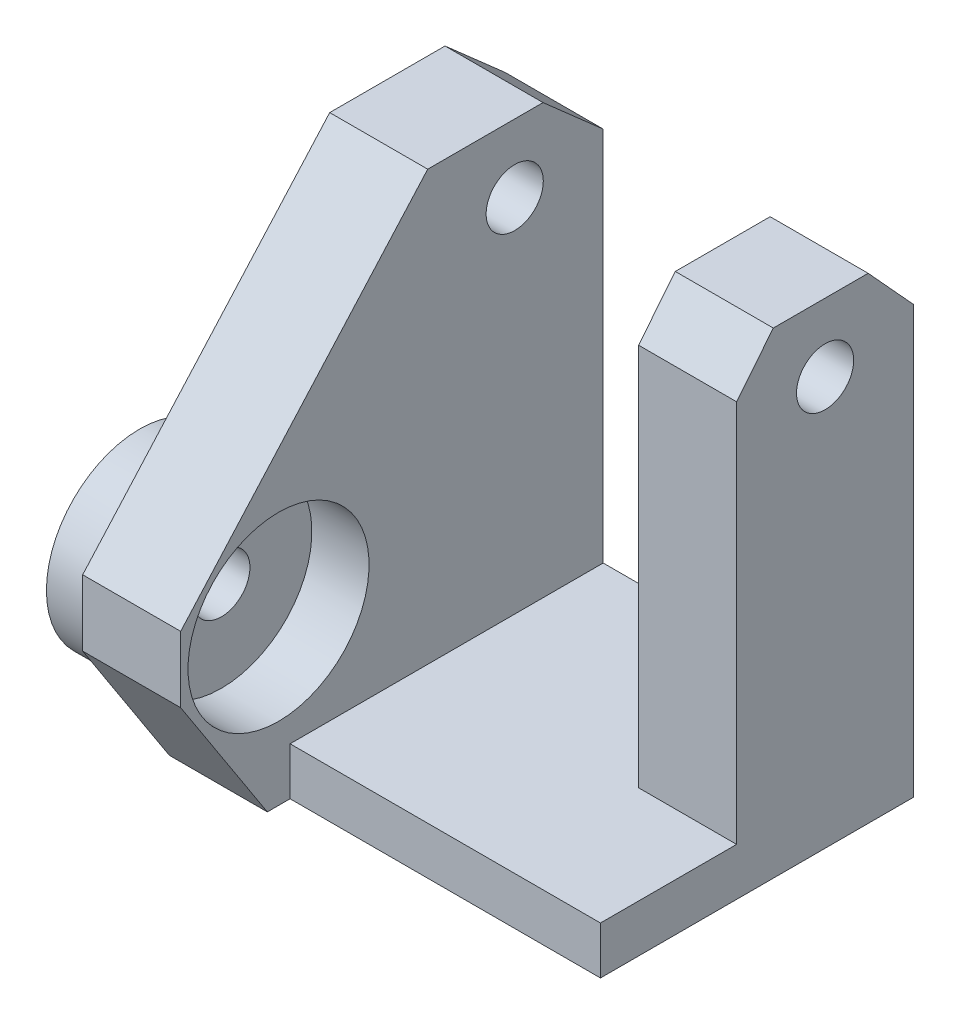
ISO-10303-21;
HEADER;
FILE_DESCRIPTION(('STEP AP214'),'2;1');
FILE_NAME('part.step','',(''),(''),'','','');
FILE_SCHEMA(('AUTOMOTIVE_DESIGN { 1 0 10303 214 1 1 1 1 }'));
ENDSEC;
DATA;
#1=APPLICATION_CONTEXT('core data for automotive mechanical design processes');
#2=APPLICATION_PROTOCOL_DEFINITION('international standard','automotive_design',2000,#1);
#3=PRODUCT_CONTEXT('',#1,'mechanical');
#4=PRODUCT('Part','Part','',(#3));
#5=PRODUCT_RELATED_PRODUCT_CATEGORY('part','',(#4));
#6=PRODUCT_DEFINITION_FORMATION('','',#4);
#7=PRODUCT_DEFINITION_CONTEXT('part definition',#1,'design');
#8=PRODUCT_DEFINITION('design','',#6,#7);
#9=PRODUCT_DEFINITION_SHAPE('','',#8);
#10=(LENGTH_UNIT() NAMED_UNIT(*) SI_UNIT(.MILLI.,.METRE.));
#11=(NAMED_UNIT(*) PLANE_ANGLE_UNIT() SI_UNIT($,.RADIAN.));
#12=(NAMED_UNIT(*) SI_UNIT($,.STERADIAN.) SOLID_ANGLE_UNIT());
#13=UNCERTAINTY_MEASURE_WITH_UNIT(LENGTH_MEASURE(1.E-05),#10,'distance_accuracy_value','');
#14=(GEOMETRIC_REPRESENTATION_CONTEXT(3) GLOBAL_UNCERTAINTY_ASSIGNED_CONTEXT((#13)) GLOBAL_UNIT_ASSIGNED_CONTEXT((#10,
#11,#12)) REPRESENTATION_CONTEXT('',''));
#15=CARTESIAN_POINT('',(0.,0.,0.));
#16=DIRECTION('',(0.,0.,1.));
#17=DIRECTION('',(1.,0.,0.));
#18=AXIS2_PLACEMENT_3D('',#15,#16,#17);
#19=CARTESIAN_POINT('',(-15.,0.,13.));
#20=DIRECTION('',(1.,0.,0.));
#21=DIRECTION('',(0.,0.,-1.));
#22=AXIS2_PLACEMENT_3D('',#19,#20,#21);
#23=PLANE('',#22);
#24=CARTESIAN_POINT('',(-15.,12.,23.8493515728975));
#25=DIRECTION('',(-1.,0.,0.));
#26=DIRECTION('',(0.,-1.,0.));
#27=AXIS2_PLACEMENT_3D('',#24,#25,#26);
#28=CIRCLE('',#27,2.1);
#29=CARTESIAN_POINT('',(-15.,9.9,23.8493515728975));
#30=VERTEX_POINT('',#29);
#31=EDGE_CURVE('E259',#30,#30,#28,.T.);
#32=ORIENTED_EDGE('',*,*,#31,.F.);
#33=EDGE_LOOP('',(#32));
#34=FACE_BOUND('',#33,.T.);
#35=CARTESIAN_POINT('',(-15.,12.,23.8493515728975));
#36=DIRECTION('',(-1.,0.,0.));
#37=DIRECTION('',(0.,0.,1.));
#38=AXIS2_PLACEMENT_3D('',#35,#36,#37);
#39=CIRCLE('',#38,5.65);
#40=CARTESIAN_POINT('',(-15.,12.,29.4993515728975));
#41=VERTEX_POINT('',#40);
#42=EDGE_CURVE('E321',#41,#41,#39,.T.);
#43=ORIENTED_EDGE('',*,*,#42,.T.);
#44=EDGE_LOOP('',(#43));
#45=FACE_BOUND('',#44,.T.);
#46=ADVANCED_FACE('F37',(#34,#45),#23,.F.);
#47=CARTESIAN_POINT('',(5.,12.,23.8493515728975));
#48=DIRECTION('',(-1.,0.,0.));
#49=DIRECTION('',(0.,-1.,0.));
#50=AXIS2_PLACEMENT_3D('',#47,#48,#49);
#51=CYLINDRICAL_SURFACE('',#50,2.1);
#52=ORIENTED_EDGE('',*,*,#31,.T.);
#53=EDGE_LOOP('',(#52));
#54=FACE_BOUND('',#53,.T.);
#55=CARTESIAN_POINT('',(-12.,12.,23.8493515728975));
#56=DIRECTION('',(1.,0.,0.));
#57=DIRECTION('',(0.,1.,0.));
#58=AXIS2_PLACEMENT_3D('',#55,#56,#57);
#59=CIRCLE('',#58,2.1);
#60=CARTESIAN_POINT('',(-12.,14.1,23.8493515728975));
#61=VERTEX_POINT('',#60);
#62=EDGE_CURVE('E179',#61,#61,#59,.F.);
#63=ORIENTED_EDGE('',*,*,#62,.F.);
#64=EDGE_LOOP('',(#63));
#65=FACE_BOUND('',#64,.T.);
#66=ADVANCED_FACE('F341',(#54,#65),#51,.F.);
#67=CARTESIAN_POINT('',(0.,0.,13.));
#68=DIRECTION('',(0.,0.,-1.));
#69=DIRECTION('',(-1.,0.,0.));
#70=AXIS2_PLACEMENT_3D('',#67,#68,#69);
#71=PLANE('',#70);
#72=DIRECTION('',(0.,1.,0.));
#73=VECTOR('',#72,1.);
#74=CARTESIAN_POINT('',(15.,0.,13.));
#75=LINE('',#74,#73);
#76=CARTESIAN_POINT('',(15.,3.5,13.));
#77=VERTEX_POINT('',#76);
#78=CARTESIAN_POINT('',(15.,31.6570509554715,13.));
#79=VERTEX_POINT('',#78);
#80=EDGE_CURVE('E199',#77,#79,#75,.T.);
#81=ORIENTED_EDGE('',*,*,#80,.T.);
#82=DIRECTION('',(1.,0.,0.));
#83=VECTOR('',#82,1.);
#84=CARTESIAN_POINT('',(4.99999999999999,31.6570509554715,13.));
#85=LINE('',#84,#83);
#86=CARTESIAN_POINT('',(7.8,31.6570509554715,13.));
#87=VERTEX_POINT('',#86);
#88=EDGE_CURVE('E160',#87,#79,#85,.T.);
#89=ORIENTED_EDGE('',*,*,#88,.F.);
#90=DIRECTION('',(0.,-1.,0.));
#91=VECTOR('',#90,1.);
#92=CARTESIAN_POINT('',(7.8,35.,13.));
#93=LINE('',#92,#91);
#94=CARTESIAN_POINT('',(7.8,3.5,13.));
#95=VERTEX_POINT('',#94);
#96=EDGE_CURVE('E190',#87,#95,#93,.T.);
#97=ORIENTED_EDGE('',*,*,#96,.T.);
#98=DIRECTION('',(-1.,0.,0.));
#99=VECTOR('',#98,1.);
#100=CARTESIAN_POINT('',(-7.8,3.5,13.));
#101=LINE('',#100,#99);
#102=EDGE_CURVE('E182',#77,#95,#101,.T.);
#103=ORIENTED_EDGE('',*,*,#102,.F.);
#104=EDGE_LOOP('',(#81,#89,#97,#103));
#105=FACE_BOUND('',#104,.T.);
#106=ADVANCED_FACE('F195',(#105),#71,.F.);
#107=CARTESIAN_POINT('',(-7.8,35.,13.));
#108=DIRECTION('',(-1.,0.,0.));
#109=DIRECTION('',(0.,-1.,0.));
#110=AXIS2_PLACEMENT_3D('',#107,#108,#109);
#111=PLANE('',#110);
#112=CARTESIAN_POINT('',(-7.8,12.,23.8493515728975));
#113=DIRECTION('',(1.,0.,0.));
#114=DIRECTION('',(0.,1.,0.));
#115=AXIS2_PLACEMENT_3D('',#112,#113,#114);
#116=CIRCLE('',#115,6.65);
#117=CARTESIAN_POINT('',(-7.8,18.65,23.8493515728975));
#118=VERTEX_POINT('',#117);
#119=EDGE_CURVE('E240',#118,#118,#116,.T.);
#120=ORIENTED_EDGE('',*,*,#119,.F.);
#121=EDGE_LOOP('',(#120));
#122=FACE_BOUND('',#121,.T.);
#123=CARTESIAN_POINT('',(-7.8,30.,6.5));
#124=DIRECTION('',(-1.,0.,0.));
#125=DIRECTION('',(0.,-1.,0.));
#126=AXIS2_PLACEMENT_3D('',#123,#124,#125);
#127=CIRCLE('',#126,2.1);
#128=CARTESIAN_POINT('',(-7.8,27.9,6.5));
#129=VERTEX_POINT('',#128);
#130=EDGE_CURVE('E174',#129,#129,#127,.T.);
#131=ORIENTED_EDGE('',*,*,#130,.T.);
#132=EDGE_LOOP('',(#131));
#133=FACE_BOUND('',#132,.T.);
#134=DIRECTION('',(0.,-1.,0.));
#135=VECTOR('',#134,1.);
#136=CARTESIAN_POINT('',(-7.8,35.,31.0362025201516));
#137=LINE('',#136,#135);
#138=CARTESIAN_POINT('',(-7.8,14.6716908801956,31.0362025201516));
#139=VERTEX_POINT('',#138);
#140=CARTESIAN_POINT('',(-7.8,9.81434295701585,31.0362025201516));
#141=VERTEX_POINT('',#140);
#142=EDGE_CURVE('E237',#139,#141,#137,.T.);
#143=ORIENTED_EDGE('',*,*,#142,.T.);
#144=DIRECTION('',(0.,-0.838960810902547,-0.544191839124532));
#145=VECTOR('',#144,1.);
#146=CARTESIAN_POINT('',(-7.8,19.3068699519676,37.1935291272964));
#147=LINE('',#146,#145);
#148=CARTESIAN_POINT('',(-7.79999999999999,0.,24.6701300240696));
#149=VERTEX_POINT('',#148);
#150=EDGE_CURVE('E234',#141,#149,#147,.T.);
#151=ORIENTED_EDGE('',*,*,#150,.T.);
#152=DIRECTION('',(0.,0.,-1.));
#153=VECTOR('',#152,1.);
#154=CARTESIAN_POINT('',(-7.79999999999999,0.,33.));
#155=LINE('',#154,#153);
#156=CARTESIAN_POINT('',(-7.8,0.,23.));
#157=VERTEX_POINT('',#156);
#158=EDGE_CURVE('E262',#149,#157,#155,.T.);
#159=ORIENTED_EDGE('',*,*,#158,.T.);
#160=DIRECTION('',(0.,-1.,0.));
#161=VECTOR('',#160,1.);
#162=CARTESIAN_POINT('',(-7.8,3.5,23.));
#163=LINE('',#162,#161);
#164=CARTESIAN_POINT('',(-7.8,3.5,23.));
#165=VERTEX_POINT('',#164);
#166=EDGE_CURVE('E245',#165,#157,#163,.T.);
#167=ORIENTED_EDGE('',*,*,#166,.F.);
#168=DIRECTION('',(0.,0.,-1.));
#169=VECTOR('',#168,1.);
#170=CARTESIAN_POINT('',(-7.8,3.5,13.));
#171=LINE('',#170,#169);
#172=CARTESIAN_POINT('',(-7.8,3.5,0.));
#173=VERTEX_POINT('',#172);
#174=EDGE_CURVE('E292',#165,#173,#171,.T.);
#175=ORIENTED_EDGE('',*,*,#174,.T.);
#176=DIRECTION('',(0.,1.,0.));
#177=VECTOR('',#176,1.);
#178=CARTESIAN_POINT('',(-7.8,35.,0.));
#179=LINE('',#178,#177);
#180=CARTESIAN_POINT('',(-7.8,31.1079291114581,0.));
#181=VERTEX_POINT('',#180);
#182=EDGE_CURVE('E273',#173,#181,#179,.T.);
#183=ORIENTED_EDGE('',*,*,#182,.T.);
#184=DIRECTION('',(0.,0.660921876712559,0.750454710747257));
#185=VECTOR('',#184,1.);
#186=CARTESIAN_POINT('',(-7.8,39.2559498363633,9.2518053218123));
#187=LINE('',#186,#185);
#188=CARTESIAN_POINT('',(-7.8,35.,4.41931646656453));
#189=VERTEX_POINT('',#188);
#190=EDGE_CURVE('E220',#181,#189,#187,.T.);
#191=ORIENTED_EDGE('',*,*,#190,.T.);
#192=DIRECTION('',(0.,0.,-1.));
#193=VECTOR('',#192,1.);
#194=CARTESIAN_POINT('',(-7.8,35.,13.));
#195=LINE('',#194,#193);
#196=CARTESIAN_POINT('',(-7.8,35.,12.8907711424314));
#197=VERTEX_POINT('',#196);
#198=EDGE_CURVE('E289',#197,#189,#195,.T.);
#199=ORIENTED_EDGE('',*,*,#198,.F.);
#200=DIRECTION('',(0.,-0.746025983320998,0.665916835806047));
#201=VECTOR('',#200,1.);
#202=CARTESIAN_POINT('',(-7.8,34.9457360579752,12.93920815854));
#203=LINE('',#202,#201);
#204=EDGE_CURVE('E231',#197,#139,#203,.T.);
#205=ORIENTED_EDGE('',*,*,#204,.T.);
#206=EDGE_LOOP('',(#143,#151,#159,#167,#175,#183,#191,#199,#205));
#207=FACE_BOUND('',#206,.T.);
#208=ADVANCED_FACE('F305',(#122,#133,#207),#111,.F.);
#209=CARTESIAN_POINT('',(-15.,12.,23.8493515728975));
#210=DIRECTION('',(1.,0.,0.));
#211=DIRECTION('',(0.,0.,-1.));
#212=AXIS2_PLACEMENT_3D('',#209,#210,#211);
#213=CIRCLE('',#212,6.85);
#214=CARTESIAN_POINT('',(-15.,12.,16.9993515728975));
#215=VERTEX_POINT('',#214);
#216=EDGE_CURVE('E11',#215,#215,#213,.F.);
#217=ORIENTED_EDGE('',*,*,#216,.F.);
#218=EDGE_LOOP('',(#217));
#219=FACE_BOUND('',#218,.T.);
#220=CARTESIAN_POINT('',(-15.,30.,6.5));
#221=DIRECTION('',(1.,0.,0.));
#222=DIRECTION('',(0.,1.,0.));
#223=AXIS2_PLACEMENT_3D('',#220,#221,#222);
#224=CIRCLE('',#223,2.1);
#225=CARTESIAN_POINT('',(-15.,32.1,6.5));
#226=VERTEX_POINT('',#225);
#227=EDGE_CURVE('E178',#226,#226,#224,.T.);
#228=ORIENTED_EDGE('',*,*,#227,.T.);
#229=EDGE_LOOP('',(#228));
#230=FACE_BOUND('',#229,.T.);
#231=DIRECTION('',(0.,0.,-1.));
#232=VECTOR('',#231,1.);
#233=CARTESIAN_POINT('',(-15.,0.,13.));
#234=LINE('',#233,#232);
#235=CARTESIAN_POINT('',(-15.,0.,24.6701300240696));
#236=VERTEX_POINT('',#235);
#237=CARTESIAN_POINT('',(-15.,0.,0.));
#238=VERTEX_POINT('',#237);
#239=EDGE_CURVE('E166',#236,#238,#234,.T.);
#240=ORIENTED_EDGE('',*,*,#239,.F.);
#241=DIRECTION('',(0.,-0.838960810902548,-0.544191839124532));
#242=VECTOR('',#241,1.);
#243=CARTESIAN_POINT('',(-15.,9.81434295701585,31.0362025201516));
#244=LINE('',#243,#242);
#245=CARTESIAN_POINT('',(-15.,9.81434295701585,31.0362025201516));
#246=VERTEX_POINT('',#245);
#247=EDGE_CURVE('E214',#246,#236,#244,.T.);
#248=ORIENTED_EDGE('',*,*,#247,.F.);
#249=DIRECTION('',(0.,-1.,0.));
#250=VECTOR('',#249,1.);
#251=CARTESIAN_POINT('',(-15.,14.6716908801956,31.0362025201516));
#252=LINE('',#251,#250);
#253=CARTESIAN_POINT('',(-15.,14.6716908801956,31.0362025201516));
#254=VERTEX_POINT('',#253);
#255=EDGE_CURVE('E210',#254,#246,#252,.T.);
#256=ORIENTED_EDGE('',*,*,#255,.F.);
#257=DIRECTION('',(0.,-0.746025983320998,0.665916835806047));
#258=VECTOR('',#257,1.);
#259=CARTESIAN_POINT('',(-15.,35.,12.8907711424314));
#260=LINE('',#259,#258);
#261=CARTESIAN_POINT('',(-15.,35.,12.8907711424314));
#262=VERTEX_POINT('',#261);
#263=EDGE_CURVE('E207',#262,#254,#260,.T.);
#264=ORIENTED_EDGE('',*,*,#263,.F.);
#265=DIRECTION('',(0.,0.,-1.));
#266=VECTOR('',#265,1.);
#267=CARTESIAN_POINT('',(-15.,35.,13.));
#268=LINE('',#267,#266);
#269=CARTESIAN_POINT('',(-15.,35.,4.41931646656453));
#270=VERTEX_POINT('',#269);
#271=EDGE_CURVE('E275',#262,#270,#268,.T.);
#272=ORIENTED_EDGE('',*,*,#271,.T.);
#273=DIRECTION('',(0.,0.660921876712559,0.750454710747257));
#274=VECTOR('',#273,1.);
#275=CARTESIAN_POINT('',(-15.,31.1079291114581,0.));
#276=LINE('',#275,#274);
#277=CARTESIAN_POINT('',(-15.,31.1079291114581,0.));
#278=VERTEX_POINT('',#277);
#279=EDGE_CURVE('E206',#278,#270,#276,.T.);
#280=ORIENTED_EDGE('',*,*,#279,.F.);
#281=DIRECTION('',(0.,-1.,0.));
#282=VECTOR('',#281,1.);
#283=CARTESIAN_POINT('',(-15.,0.,0.));
#284=LINE('',#283,#282);
#285=EDGE_CURVE('E271',#278,#238,#284,.T.);
#286=ORIENTED_EDGE('',*,*,#285,.T.);
#287=EDGE_LOOP('',(#240,#248,#256,#264,#272,#280,#286));
#288=FACE_BOUND('',#287,.T.);
#289=ADVANCED_FACE('F39',(#219,#230,#288),#23,.F.);
#290=CARTESIAN_POINT('',(15.,0.,13.));
#291=DIRECTION('',(0.,1.,0.));
#292=DIRECTION('',(-1.,0.,0.));
#293=AXIS2_PLACEMENT_3D('',#290,#291,#292);
#294=PLANE('',#293);
#295=ORIENTED_EDGE('',*,*,#158,.F.);
#296=DIRECTION('',(-1.,0.,0.));
#297=VECTOR('',#296,1.);
#298=CARTESIAN_POINT('',(-5.,0.,24.6701300240696));
#299=LINE('',#298,#297);
#300=EDGE_CURVE('E217',#149,#236,#299,.T.);
#301=ORIENTED_EDGE('',*,*,#300,.T.);
#302=ORIENTED_EDGE('',*,*,#239,.T.);
#303=DIRECTION('',(1.,0.,0.));
#304=VECTOR('',#303,1.);
#305=CARTESIAN_POINT('',(15.,0.,0.));
#306=LINE('',#305,#304);
#307=CARTESIAN_POINT('',(15.,0.,0.));
#308=VERTEX_POINT('',#307);
#309=EDGE_CURVE('E278',#238,#308,#306,.T.);
#310=ORIENTED_EDGE('',*,*,#309,.T.);
#311=DIRECTION('',(0.,0.,-1.));
#312=VECTOR('',#311,1.);
#313=CARTESIAN_POINT('',(15.,0.,13.));
#314=LINE('',#313,#312);
#315=CARTESIAN_POINT('',(15.,0.,23.));
#316=VERTEX_POINT('',#315);
#317=EDGE_CURVE('E163',#316,#308,#314,.T.);
#318=ORIENTED_EDGE('',*,*,#317,.F.);
#319=DIRECTION('',(1.,0.,0.));
#320=VECTOR('',#319,1.);
#321=CARTESIAN_POINT('',(-7.8,0.,23.));
#322=LINE('',#321,#320);
#323=EDGE_CURVE('E248',#157,#316,#322,.T.);
#324=ORIENTED_EDGE('',*,*,#323,.F.);
#325=EDGE_LOOP('',(#295,#301,#302,#310,#318,#324));
#326=FACE_BOUND('',#325,.T.);
#327=ADVANCED_FACE('F350',(#326),#294,.F.);
#328=CARTESIAN_POINT('',(15.,0.,13.));
#329=DIRECTION('',(-1.,0.,0.));
#330=DIRECTION('',(0.,-1.,0.));
#331=AXIS2_PLACEMENT_3D('',#328,#329,#330);
#332=PLANE('',#331);
#333=CARTESIAN_POINT('',(15.,30.,6.5));
#334=DIRECTION('',(1.,0.,0.));
#335=DIRECTION('',(0.,1.,0.));
#336=AXIS2_PLACEMENT_3D('',#333,#334,#335);
#337=CIRCLE('',#336,2.1);
#338=CARTESIAN_POINT('',(15.,32.1,6.5));
#339=VERTEX_POINT('',#338);
#340=EDGE_CURVE('E264',#339,#339,#337,.T.);
#341=ORIENTED_EDGE('',*,*,#340,.F.);
#342=EDGE_LOOP('',(#341));
#343=FACE_BOUND('',#342,.T.);
#344=DIRECTION('',(0.,1.,0.));
#345=VECTOR('',#344,1.);
#346=CARTESIAN_POINT('',(15.,0.,0.));
#347=LINE('',#346,#345);
#348=CARTESIAN_POINT('',(15.,31.3481698437158,0.));
#349=VERTEX_POINT('',#348);
#350=EDGE_CURVE('E159',#308,#349,#347,.T.);
#351=ORIENTED_EDGE('',*,*,#350,.T.);
#352=DIRECTION('',(0.,-0.738235120144559,-0.674543480722443));
#353=VECTOR('',#352,1.);
#354=CARTESIAN_POINT('',(15.,35.,3.33676650894744));
#355=LINE('',#354,#353);
#356=CARTESIAN_POINT('',(15.,35.,3.33676650894744));
#357=VERTEX_POINT('',#356);
#358=EDGE_CURVE('E60',#357,#349,#355,.T.);
#359=ORIENTED_EDGE('',*,*,#358,.F.);
#360=DIRECTION('',(0.,0.,-1.));
#361=VECTOR('',#360,1.);
#362=CARTESIAN_POINT('',(15.,35.,13.));
#363=LINE('',#362,#361);
#364=CARTESIAN_POINT('',(15.,35.,10.3037515852158));
#365=VERTEX_POINT('',#364);
#366=EDGE_CURVE('E156',#365,#357,#363,.T.);
#367=ORIENTED_EDGE('',*,*,#366,.F.);
#368=DIRECTION('',(0.,0.778376428250915,-0.6277978463991));
#369=VECTOR('',#368,1.);
#370=CARTESIAN_POINT('',(15.,31.6570509554715,13.));
#371=LINE('',#370,#369);
#372=EDGE_CURVE('E201',#79,#365,#371,.T.);
#373=ORIENTED_EDGE('',*,*,#372,.F.);
#374=ORIENTED_EDGE('',*,*,#80,.F.);
#375=DIRECTION('',(0.,0.,-1.));
#376=VECTOR('',#375,1.);
#377=CARTESIAN_POINT('',(15.,3.5,23.));
#378=LINE('',#377,#376);
#379=CARTESIAN_POINT('',(15.,3.5,23.));
#380=VERTEX_POINT('',#379);
#381=EDGE_CURVE('E256',#380,#77,#378,.T.);
#382=ORIENTED_EDGE('',*,*,#381,.F.);
#383=DIRECTION('',(0.,1.,0.));
#384=VECTOR('',#383,1.);
#385=CARTESIAN_POINT('',(15.,3.5,23.));
#386=LINE('',#385,#384);
#387=EDGE_CURVE('E251',#316,#380,#386,.T.);
#388=ORIENTED_EDGE('',*,*,#387,.F.);
#389=ORIENTED_EDGE('',*,*,#317,.T.);
#390=EDGE_LOOP('',(#351,#359,#367,#373,#374,#382,#388,#389));
#391=FACE_BOUND('',#390,.T.);
#392=ADVANCED_FACE('F154',(#343,#391),#332,.F.);
#393=CARTESIAN_POINT('',(15.,35.,13.));
#394=DIRECTION('',(0.,-1.,0.));
#395=DIRECTION('',(0.,0.,-1.));
#396=AXIS2_PLACEMENT_3D('',#393,#394,#395);
#397=PLANE('',#396);
#398=ORIENTED_EDGE('',*,*,#366,.T.);
#399=DIRECTION('',(1.,0.,0.));
#400=VECTOR('',#399,1.);
#401=CARTESIAN_POINT('',(4.99999999999999,35.,3.33676650894744));
#402=LINE('',#401,#400);
#403=CARTESIAN_POINT('',(7.8,35.,3.33676650894744));
#404=VERTEX_POINT('',#403);
#405=EDGE_CURVE('E142',#404,#357,#402,.T.);
#406=ORIENTED_EDGE('',*,*,#405,.F.);
#407=DIRECTION('',(0.,0.,-1.));
#408=VECTOR('',#407,1.);
#409=CARTESIAN_POINT('',(7.8,35.,13.));
#410=LINE('',#409,#408);
#411=CARTESIAN_POINT('',(7.8,35.,10.3037515852158));
#412=VERTEX_POINT('',#411);
#413=EDGE_CURVE('E164',#412,#404,#410,.T.);
#414=ORIENTED_EDGE('',*,*,#413,.F.);
#415=DIRECTION('',(1.,0.,0.));
#416=VECTOR('',#415,1.);
#417=CARTESIAN_POINT('',(4.99999999999999,35.,10.3037515852158));
#418=LINE('',#417,#416);
#419=EDGE_CURVE('E52',#412,#365,#418,.T.);
#420=ORIENTED_EDGE('',*,*,#419,.T.);
#421=EDGE_LOOP('',(#398,#406,#414,#420));
#422=FACE_BOUND('',#421,.T.);
#423=ADVANCED_FACE('F162',(#422),#397,.F.);
#424=CARTESIAN_POINT('',(7.8,35.,13.));
#425=DIRECTION('',(1.,0.,0.));
#426=DIRECTION('',(0.,1.,0.));
#427=AXIS2_PLACEMENT_3D('',#424,#425,#426);
#428=PLANE('',#427);
#429=CARTESIAN_POINT('',(7.79999999999999,30.,6.5));
#430=DIRECTION('',(1.,0.,0.));
#431=DIRECTION('',(0.,1.,0.));
#432=AXIS2_PLACEMENT_3D('',#429,#430,#431);
#433=CIRCLE('',#432,2.1);
#434=CARTESIAN_POINT('',(7.79999999999999,32.1,6.5));
#435=VERTEX_POINT('',#434);
#436=EDGE_CURVE('E177',#435,#435,#433,.T.);
#437=ORIENTED_EDGE('',*,*,#436,.T.);
#438=EDGE_LOOP('',(#437));
#439=FACE_BOUND('',#438,.T.);
#440=ORIENTED_EDGE('',*,*,#413,.T.);
#441=DIRECTION('',(0.,-0.738235120144559,-0.674543480722443));
#442=VECTOR('',#441,1.);
#443=CARTESIAN_POINT('',(7.79999999999999,39.8120166885732,7.73362382151884));
#444=LINE('',#443,#442);
#445=CARTESIAN_POINT('',(7.8,31.3481698437158,0.));
#446=VERTEX_POINT('',#445);
#447=EDGE_CURVE('E145',#404,#446,#444,.T.);
#448=ORIENTED_EDGE('',*,*,#447,.T.);
#449=DIRECTION('',(0.,-1.,0.));
#450=VECTOR('',#449,1.);
#451=CARTESIAN_POINT('',(7.8,35.,0.));
#452=LINE('',#451,#450);
#453=CARTESIAN_POINT('',(7.8,3.5,0.));
#454=VERTEX_POINT('',#453);
#455=EDGE_CURVE('E281',#446,#454,#452,.T.);
#456=ORIENTED_EDGE('',*,*,#455,.T.);
#457=DIRECTION('',(0.,0.,-1.));
#458=VECTOR('',#457,1.);
#459=CARTESIAN_POINT('',(7.8,3.5,13.));
#460=LINE('',#459,#458);
#461=EDGE_CURVE('E168',#95,#454,#460,.T.);
#462=ORIENTED_EDGE('',*,*,#461,.F.);
#463=ORIENTED_EDGE('',*,*,#96,.F.);
#464=DIRECTION('',(0.,0.778376428250915,-0.6277978463991));
#465=VECTOR('',#464,1.);
#466=CARTESIAN_POINT('',(7.8,33.6824430386283,11.3664243394717));
#467=LINE('',#466,#465);
#468=EDGE_CURVE('E45',#87,#412,#467,.T.);
#469=ORIENTED_EDGE('',*,*,#468,.T.);
#470=EDGE_LOOP('',(#440,#448,#456,#462,#463,#469));
#471=FACE_BOUND('',#470,.T.);
#472=ADVANCED_FACE('F188',(#439,#471),#428,.F.);
#473=CARTESIAN_POINT('',(-7.8,3.5,13.));
#474=DIRECTION('',(0.,-1.,0.));
#475=DIRECTION('',(1.,0.,0.));
#476=AXIS2_PLACEMENT_3D('',#473,#474,#475);
#477=PLANE('',#476);
#478=DIRECTION('',(-1.,0.,0.));
#479=VECTOR('',#478,1.);
#480=CARTESIAN_POINT('',(-7.8,3.5,0.));
#481=LINE('',#480,#479);
#482=EDGE_CURVE('E283',#454,#173,#481,.T.);
#483=ORIENTED_EDGE('',*,*,#482,.T.);
#484=ORIENTED_EDGE('',*,*,#174,.F.);
#485=DIRECTION('',(-1.,0.,0.));
#486=VECTOR('',#485,1.);
#487=CARTESIAN_POINT('',(-7.8,3.5,23.));
#488=LINE('',#487,#486);
#489=EDGE_CURVE('E253',#380,#165,#488,.T.);
#490=ORIENTED_EDGE('',*,*,#489,.F.);
#491=ORIENTED_EDGE('',*,*,#381,.T.);
#492=ORIENTED_EDGE('',*,*,#102,.T.);
#493=ORIENTED_EDGE('',*,*,#461,.T.);
#494=EDGE_LOOP('',(#483,#484,#490,#491,#492,#493));
#495=FACE_BOUND('',#494,.T.);
#496=ADVANCED_FACE('F297',(#495),#477,.F.);
#497=CARTESIAN_POINT('',(-15.,35.,13.));
#498=DIRECTION('',(0.,-1.,0.));
#499=DIRECTION('',(1.,0.,0.));
#500=AXIS2_PLACEMENT_3D('',#497,#498,#499);
#501=PLANE('',#500);
#502=ORIENTED_EDGE('',*,*,#271,.F.);
#503=DIRECTION('',(-1.,0.,0.));
#504=VECTOR('',#503,1.);
#505=CARTESIAN_POINT('',(-5.,35.,12.8907711424314));
#506=LINE('',#505,#504);
#507=EDGE_CURVE('E216',#197,#262,#506,.T.);
#508=ORIENTED_EDGE('',*,*,#507,.F.);
#509=ORIENTED_EDGE('',*,*,#198,.T.);
#510=DIRECTION('',(-1.,0.,0.));
#511=VECTOR('',#510,1.);
#512=CARTESIAN_POINT('',(-5.,35.,4.41931646656453));
#513=LINE('',#512,#511);
#514=EDGE_CURVE('E211',#189,#270,#513,.T.);
#515=ORIENTED_EDGE('',*,*,#514,.T.);
#516=EDGE_LOOP('',(#502,#508,#509,#515));
#517=FACE_BOUND('',#516,.T.);
#518=ADVANCED_FACE('F381',(#517),#501,.F.);
#519=CARTESIAN_POINT('',(0.,0.,0.));
#520=DIRECTION('',(0.,0.,-1.));
#521=DIRECTION('',(-1.,0.,0.));
#522=AXIS2_PLACEMENT_3D('',#519,#520,#521);
#523=PLANE('',#522);
#524=DIRECTION('',(-1.,0.,0.));
#525=VECTOR('',#524,1.);
#526=CARTESIAN_POINT('',(0.,31.3481698437158,0.));
#527=LINE('',#526,#525);
#528=EDGE_CURVE('E185',#349,#446,#527,.T.);
#529=ORIENTED_EDGE('',*,*,#528,.F.);
#530=ORIENTED_EDGE('',*,*,#350,.F.);
#531=ORIENTED_EDGE('',*,*,#309,.F.);
#532=ORIENTED_EDGE('',*,*,#285,.F.);
#533=DIRECTION('',(-1.,0.,0.));
#534=VECTOR('',#533,1.);
#535=CARTESIAN_POINT('',(0.,31.1079291114581,0.));
#536=LINE('',#535,#534);
#537=EDGE_CURVE('E173',#181,#278,#536,.T.);
#538=ORIENTED_EDGE('',*,*,#537,.F.);
#539=ORIENTED_EDGE('',*,*,#182,.F.);
#540=ORIENTED_EDGE('',*,*,#482,.F.);
#541=ORIENTED_EDGE('',*,*,#455,.F.);
#542=EDGE_LOOP('',(#529,#530,#531,#532,#538,#539,#540,#541));
#543=FACE_BOUND('',#542,.T.);
#544=ADVANCED_FACE('F301',(#543),#523,.T.);
#545=CARTESIAN_POINT('',(-15.,30.,6.5));
#546=DIRECTION('',(1.,0.,0.));
#547=DIRECTION('',(0.,1.,0.));
#548=AXIS2_PLACEMENT_3D('',#545,#546,#547);
#549=CYLINDRICAL_SURFACE('',#548,2.1);
#550=ORIENTED_EDGE('',*,*,#227,.F.);
#551=EDGE_LOOP('',(#550));
#552=FACE_BOUND('',#551,.T.);
#553=ORIENTED_EDGE('',*,*,#130,.F.);
#554=EDGE_LOOP('',(#553));
#555=FACE_BOUND('',#554,.T.);
#556=ADVANCED_FACE('F405',(#552,#555),#549,.F.);
#557=ORIENTED_EDGE('',*,*,#340,.T.);
#558=EDGE_LOOP('',(#557));
#559=FACE_BOUND('',#558,.T.);
#560=ORIENTED_EDGE('',*,*,#436,.F.);
#561=EDGE_LOOP('',(#560));
#562=FACE_BOUND('',#561,.T.);
#563=ADVANCED_FACE('F401',(#559,#562),#549,.F.);
#564=CARTESIAN_POINT('',(0.,0.,23.));
#565=DIRECTION('',(0.,0.,1.));
#566=DIRECTION('',(1.,0.,0.));
#567=AXIS2_PLACEMENT_3D('',#564,#565,#566);
#568=PLANE('',#567);
#569=ORIENTED_EDGE('',*,*,#166,.T.);
#570=ORIENTED_EDGE('',*,*,#323,.T.);
#571=ORIENTED_EDGE('',*,*,#387,.T.);
#572=ORIENTED_EDGE('',*,*,#489,.T.);
#573=EDGE_LOOP('',(#569,#570,#571,#572));
#574=FACE_BOUND('',#573,.T.);
#575=ADVANCED_FACE('F310',(#574),#568,.T.);
#576=CARTESIAN_POINT('',(-12.,12.,23.8493515728975));
#577=DIRECTION('',(1.,0.,0.));
#578=DIRECTION('',(0.,1.,0.));
#579=AXIS2_PLACEMENT_3D('',#576,#577,#578);
#580=PLANE('',#579);
#581=CARTESIAN_POINT('',(-12.,12.,23.8493515728975));
#582=DIRECTION('',(1.,0.,0.));
#583=DIRECTION('',(0.,1.,0.));
#584=AXIS2_PLACEMENT_3D('',#581,#582,#583);
#585=CIRCLE('',#584,6.65);
#586=CARTESIAN_POINT('',(-12.,18.65,23.8493515728975));
#587=VERTEX_POINT('',#586);
#588=EDGE_CURVE('E183',#587,#587,#585,.T.);
#589=ORIENTED_EDGE('',*,*,#588,.T.);
#590=EDGE_LOOP('',(#589));
#591=FACE_BOUND('',#590,.T.);
#592=ORIENTED_EDGE('',*,*,#62,.T.);
#593=EDGE_LOOP('',(#592));
#594=FACE_BOUND('',#593,.T.);
#595=ADVANCED_FACE('F392',(#591,#594),#580,.T.);
#596=CARTESIAN_POINT('',(-12.,12.,23.8493515728975));
#597=DIRECTION('',(1.,0.,0.));
#598=DIRECTION('',(0.,1.,0.));
#599=AXIS2_PLACEMENT_3D('',#596,#597,#598);
#600=CYLINDRICAL_SURFACE('',#599,6.65);
#601=ORIENTED_EDGE('',*,*,#588,.F.);
#602=EDGE_LOOP('',(#601));
#603=FACE_BOUND('',#602,.T.);
#604=ORIENTED_EDGE('',*,*,#119,.T.);
#605=EDGE_LOOP('',(#604));
#606=FACE_BOUND('',#605,.T.);
#607=ADVANCED_FACE('F385',(#603,#606),#600,.F.);
#608=CARTESIAN_POINT('',(-5.,31.1079291114581,0.));
#609=DIRECTION('',(0.,-0.750454710747257,0.660921876712559));
#610=DIRECTION('',(0.,-0.660921876712559,-0.750454710747257));
#611=AXIS2_PLACEMENT_3D('',#608,#609,#610);
#612=PLANE('',#611);
#613=ORIENTED_EDGE('',*,*,#537,.T.);
#614=ORIENTED_EDGE('',*,*,#279,.T.);
#615=ORIENTED_EDGE('',*,*,#514,.F.);
#616=ORIENTED_EDGE('',*,*,#190,.F.);
#617=EDGE_LOOP('',(#613,#614,#615,#616));
#618=FACE_BOUND('',#617,.T.);
#619=ADVANCED_FACE('F383',(#618),#612,.F.);
#620=CARTESIAN_POINT('',(-5.,14.6716908801956,31.0362025201516));
#621=DIRECTION('',(0.,0.,-1.));
#622=DIRECTION('',(0.,1.,0.));
#623=AXIS2_PLACEMENT_3D('',#620,#621,#622);
#624=PLANE('',#623);
#625=DIRECTION('',(-1.,0.,0.));
#626=VECTOR('',#625,1.);
#627=CARTESIAN_POINT('',(-5.,14.6716908801956,31.0362025201516));
#628=LINE('',#627,#626);
#629=EDGE_CURVE('E223',#139,#254,#628,.T.);
#630=ORIENTED_EDGE('',*,*,#629,.T.);
#631=ORIENTED_EDGE('',*,*,#255,.T.);
#632=DIRECTION('',(-1.,0.,0.));
#633=VECTOR('',#632,1.);
#634=CARTESIAN_POINT('',(-5.,9.81434295701585,31.0362025201516));
#635=LINE('',#634,#633);
#636=EDGE_CURVE('E221',#141,#246,#635,.T.);
#637=ORIENTED_EDGE('',*,*,#636,.F.);
#638=ORIENTED_EDGE('',*,*,#142,.F.);
#639=EDGE_LOOP('',(#630,#631,#637,#638));
#640=FACE_BOUND('',#639,.T.);
#641=ADVANCED_FACE('F374',(#640),#624,.F.);
#642=CARTESIAN_POINT('',(-5.,9.81434295701585,31.0362025201516));
#643=DIRECTION('',(0.,0.544191839124532,-0.838960810902548));
#644=DIRECTION('',(0.,0.838960810902548,0.544191839124532));
#645=AXIS2_PLACEMENT_3D('',#642,#643,#644);
#646=PLANE('',#645);
#647=ORIENTED_EDGE('',*,*,#636,.T.);
#648=ORIENTED_EDGE('',*,*,#247,.T.);
#649=ORIENTED_EDGE('',*,*,#300,.F.);
#650=ORIENTED_EDGE('',*,*,#150,.F.);
#651=EDGE_LOOP('',(#647,#648,#649,#650));
#652=FACE_BOUND('',#651,.T.);
#653=ADVANCED_FACE('F370',(#652),#646,.F.);
#654=CARTESIAN_POINT('',(-5.,35.,12.8907711424314));
#655=DIRECTION('',(0.,-0.665916835806047,-0.746025983320998));
#656=DIRECTION('',(0.,0.746025983320998,-0.665916835806047));
#657=AXIS2_PLACEMENT_3D('',#654,#655,#656);
#658=PLANE('',#657);
#659=ORIENTED_EDGE('',*,*,#507,.T.);
#660=ORIENTED_EDGE('',*,*,#263,.T.);
#661=ORIENTED_EDGE('',*,*,#629,.F.);
#662=ORIENTED_EDGE('',*,*,#204,.F.);
#663=EDGE_LOOP('',(#659,#660,#661,#662));
#664=FACE_BOUND('',#663,.T.);
#665=ADVANCED_FACE('F376',(#664),#658,.F.);
#666=CARTESIAN_POINT('',(4.99999999999999,35.,3.33676650894744));
#667=DIRECTION('',(0.,-0.674543480722443,0.738235120144559));
#668=DIRECTION('',(0.,-0.738235120144559,-0.674543480722443));
#669=AXIS2_PLACEMENT_3D('',#666,#667,#668);
#670=PLANE('',#669);
#671=ORIENTED_EDGE('',*,*,#405,.T.);
#672=ORIENTED_EDGE('',*,*,#358,.T.);
#673=ORIENTED_EDGE('',*,*,#528,.T.);
#674=ORIENTED_EDGE('',*,*,#447,.F.);
#675=EDGE_LOOP('',(#671,#672,#673,#674));
#676=FACE_BOUND('',#675,.T.);
#677=ADVANCED_FACE('F143',(#676),#670,.F.);
#678=CARTESIAN_POINT('',(4.99999999999999,31.6570509554715,13.));
#679=DIRECTION('',(0.,-0.6277978463991,-0.778376428250915));
#680=DIRECTION('',(0.,0.778376428250915,-0.6277978463991));
#681=AXIS2_PLACEMENT_3D('',#678,#679,#680);
#682=PLANE('',#681);
#683=ORIENTED_EDGE('',*,*,#88,.T.);
#684=ORIENTED_EDGE('',*,*,#372,.T.);
#685=ORIENTED_EDGE('',*,*,#419,.F.);
#686=ORIENTED_EDGE('',*,*,#468,.F.);
#687=EDGE_LOOP('',(#683,#684,#685,#686));
#688=FACE_BOUND('',#687,.T.);
#689=ADVANCED_FACE('F192',(#688),#682,.F.);
#690=CARTESIAN_POINT('',(-18.,12.,23.8493515728975));
#691=DIRECTION('',(-1.,0.,0.));
#692=DIRECTION('',(0.,0.,1.));
#693=AXIS2_PLACEMENT_3D('',#690,#691,#692);
#694=PLANE('',#693);
#695=CARTESIAN_POINT('',(-18.,12.,23.8493515728975));
#696=DIRECTION('',(-1.,0.,0.));
#697=DIRECTION('',(0.,0.,1.));
#698=AXIS2_PLACEMENT_3D('',#695,#696,#697);
#699=CIRCLE('',#698,6.85);
#700=CARTESIAN_POINT('',(-18.,12.,30.6993515728975));
#701=VERTEX_POINT('',#700);
#702=EDGE_CURVE('E314',#701,#701,#699,.T.);
#703=ORIENTED_EDGE('',*,*,#702,.T.);
#704=EDGE_LOOP('',(#703));
#705=FACE_BOUND('',#704,.T.);
#706=CARTESIAN_POINT('',(-18.,12.,23.8493515728975));
#707=DIRECTION('',(-1.,0.,0.));
#708=DIRECTION('',(0.,0.,1.));
#709=AXIS2_PLACEMENT_3D('',#706,#707,#708);
#710=CIRCLE('',#709,5.65);
#711=CARTESIAN_POINT('',(-18.,12.,29.4993515728975));
#712=VERTEX_POINT('',#711);
#713=EDGE_CURVE('E316',#712,#712,#710,.T.);
#714=ORIENTED_EDGE('',*,*,#713,.F.);
#715=EDGE_LOOP('',(#714));
#716=FACE_BOUND('',#715,.T.);
#717=ADVANCED_FACE('F336',(#705,#716),#694,.T.);
#718=CARTESIAN_POINT('',(-18.,12.,23.8493515728975));
#719=DIRECTION('',(1.,0.,0.));
#720=DIRECTION('',(0.,0.,-1.));
#721=AXIS2_PLACEMENT_3D('',#718,#719,#720);
#722=CYLINDRICAL_SURFACE('',#721,6.85);
#723=ORIENTED_EDGE('',*,*,#702,.F.);
#724=EDGE_LOOP('',(#723));
#725=FACE_BOUND('',#724,.T.);
#726=ORIENTED_EDGE('',*,*,#216,.T.);
#727=EDGE_LOOP('',(#726));
#728=FACE_BOUND('',#727,.T.);
#729=ADVANCED_FACE('F330',(#725,#728),#722,.T.);
#730=CARTESIAN_POINT('',(-18.,12.,23.8493515728975));
#731=DIRECTION('',(1.,0.,0.));
#732=DIRECTION('',(0.,0.,-1.));
#733=AXIS2_PLACEMENT_3D('',#730,#731,#732);
#734=CYLINDRICAL_SURFACE('',#733,5.65);
#735=ORIENTED_EDGE('',*,*,#713,.T.);
#736=EDGE_LOOP('',(#735));
#737=FACE_BOUND('',#736,.T.);
#738=ORIENTED_EDGE('',*,*,#42,.F.);
#739=EDGE_LOOP('',(#738));
#740=FACE_BOUND('',#739,.T.);
#741=ADVANCED_FACE('F328',(#737,#740),#734,.F.);
#742=CLOSED_SHELL('',(#46,#66,#106,#208,#289,#327,#392,#423,#472,#496,#518,#544,#556,#563,#575,
#595,#607,#619,#641,#653,#665,#677,#689,#717,#729,#741));
#743=MANIFOLD_SOLID_BREP('B2',#742);
#744=ADVANCED_BREP_SHAPE_REPRESENTATION('',(#18,#743),#14);
#745=SHAPE_DEFINITION_REPRESENTATION(#9,#744);
ENDSEC;
END-ISO-10303-21;
